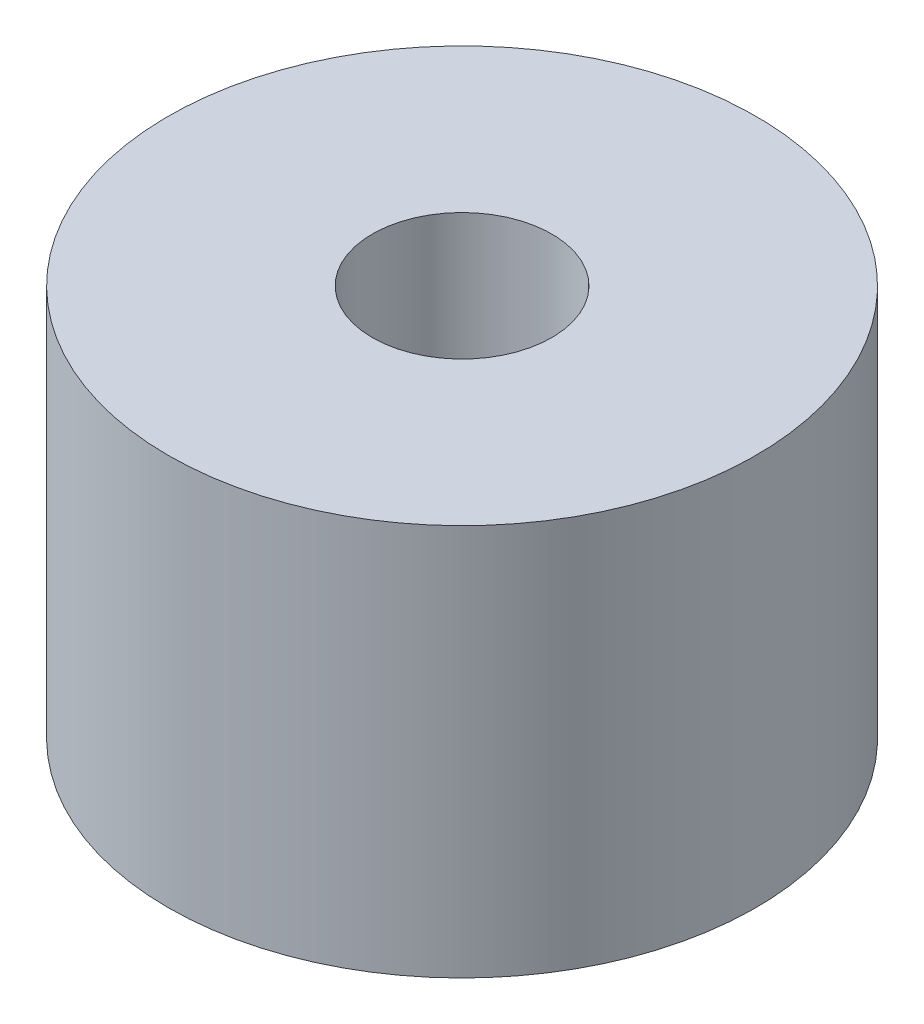
ISO-10303-21;
HEADER;
FILE_DESCRIPTION(('STEP AP214'),'2;1');
FILE_NAME('part.step','',(''),(''),'','','');
FILE_SCHEMA(('AUTOMOTIVE_DESIGN { 1 0 10303 214 1 1 1 1 }'));
ENDSEC;
DATA;
#1=APPLICATION_CONTEXT('core data for automotive mechanical design processes');
#2=APPLICATION_PROTOCOL_DEFINITION('international standard','automotive_design',2000,#1);
#3=PRODUCT_CONTEXT('',#1,'mechanical');
#4=PRODUCT('Part','Part','',(#3));
#5=PRODUCT_RELATED_PRODUCT_CATEGORY('part','',(#4));
#6=PRODUCT_DEFINITION_FORMATION('','',#4);
#7=PRODUCT_DEFINITION_CONTEXT('part definition',#1,'design');
#8=PRODUCT_DEFINITION('design','',#6,#7);
#9=PRODUCT_DEFINITION_SHAPE('','',#8);
#10=(LENGTH_UNIT() NAMED_UNIT(*) SI_UNIT(.MILLI.,.METRE.));
#11=(NAMED_UNIT(*) PLANE_ANGLE_UNIT() SI_UNIT($,.RADIAN.));
#12=(NAMED_UNIT(*) SI_UNIT($,.STERADIAN.) SOLID_ANGLE_UNIT());
#13=UNCERTAINTY_MEASURE_WITH_UNIT(LENGTH_MEASURE(1.E-05),#10,'distance_accuracy_value','');
#14=(GEOMETRIC_REPRESENTATION_CONTEXT(3) GLOBAL_UNCERTAINTY_ASSIGNED_CONTEXT((#13)) GLOBAL_UNIT_ASSIGNED_CONTEXT((#10,
#11,#12)) REPRESENTATION_CONTEXT('',''));
#15=CARTESIAN_POINT('',(0.,0.,0.));
#16=DIRECTION('',(0.,0.,1.));
#17=DIRECTION('',(1.,0.,0.));
#18=AXIS2_PLACEMENT_3D('',#15,#16,#17);
#19=CARTESIAN_POINT('',(0.,24.,0.));
#20=DIRECTION('',(0.,1.,0.));
#21=DIRECTION('',(0.,0.,1.));
#22=AXIS2_PLACEMENT_3D('',#19,#20,#21);
#23=PLANE('',#22);
#24=CARTESIAN_POINT('',(0.,24.,0.));
#25=DIRECTION('',(0.,1.,0.));
#26=DIRECTION('',(0.,0.,1.));
#27=AXIS2_PLACEMENT_3D('',#24,#25,#26);
#28=CIRCLE('',#27,18.);
#29=CARTESIAN_POINT('',(0.,24.,18.));
#30=VERTEX_POINT('',#29);
#31=EDGE_CURVE('E10',#30,#30,#28,.T.);
#32=ORIENTED_EDGE('',*,*,#31,.T.);
#33=EDGE_LOOP('',(#32));
#34=FACE_BOUND('',#33,.T.);
#35=CARTESIAN_POINT('',(0.,24.,0.));
#36=DIRECTION('',(0.,1.,0.));
#37=DIRECTION('',(0.,0.,1.));
#38=AXIS2_PLACEMENT_3D('',#35,#36,#37);
#39=CIRCLE('',#38,5.5);
#40=CARTESIAN_POINT('',(0.,24.,5.5));
#41=VERTEX_POINT('',#40);
#42=EDGE_CURVE('E41',#41,#41,#39,.T.);
#43=ORIENTED_EDGE('',*,*,#42,.F.);
#44=EDGE_LOOP('',(#43));
#45=FACE_BOUND('',#44,.T.);
#46=ADVANCED_FACE('F30',(#34,#45),#23,.T.);
#47=CARTESIAN_POINT('',(0.,0.,0.));
#48=DIRECTION('',(0.,1.,0.));
#49=DIRECTION('',(0.,0.,1.));
#50=AXIS2_PLACEMENT_3D('',#47,#48,#49);
#51=PLANE('',#50);
#52=CARTESIAN_POINT('',(0.,0.,0.));
#53=DIRECTION('',(0.,1.,0.));
#54=DIRECTION('',(0.,0.,1.));
#55=AXIS2_PLACEMENT_3D('',#52,#53,#54);
#56=CIRCLE('',#55,18.);
#57=CARTESIAN_POINT('',(0.,0.,18.));
#58=VERTEX_POINT('',#57);
#59=EDGE_CURVE('E34',#58,#58,#56,.T.);
#60=ORIENTED_EDGE('',*,*,#59,.F.);
#61=EDGE_LOOP('',(#60));
#62=FACE_BOUND('',#61,.T.);
#63=CARTESIAN_POINT('',(0.,0.,0.));
#64=DIRECTION('',(0.,1.,0.));
#65=DIRECTION('',(0.,0.,1.));
#66=AXIS2_PLACEMENT_3D('',#63,#64,#65);
#67=CIRCLE('',#66,5.5);
#68=CARTESIAN_POINT('',(0.,0.,5.5));
#69=VERTEX_POINT('',#68);
#70=EDGE_CURVE('E43',#69,#69,#67,.T.);
#71=ORIENTED_EDGE('',*,*,#70,.T.);
#72=EDGE_LOOP('',(#71));
#73=FACE_BOUND('',#72,.T.);
#74=ADVANCED_FACE('F53',(#62,#73),#51,.F.);
#75=CARTESIAN_POINT('',(0.,24.,0.));
#76=DIRECTION('',(0.,-1.,0.));
#77=DIRECTION('',(0.,0.,-1.));
#78=AXIS2_PLACEMENT_3D('',#75,#76,#77);
#79=CYLINDRICAL_SURFACE('',#78,18.);
#80=ORIENTED_EDGE('',*,*,#31,.F.);
#81=EDGE_LOOP('',(#80));
#82=FACE_BOUND('',#81,.T.);
#83=ORIENTED_EDGE('',*,*,#59,.T.);
#84=EDGE_LOOP('',(#83));
#85=FACE_BOUND('',#84,.T.);
#86=ADVANCED_FACE('F32',(#82,#85),#79,.T.);
#87=CARTESIAN_POINT('',(0.,24.,0.));
#88=DIRECTION('',(0.,-1.,0.));
#89=DIRECTION('',(0.,0.,-1.));
#90=AXIS2_PLACEMENT_3D('',#87,#88,#89);
#91=CYLINDRICAL_SURFACE('',#90,5.5);
#92=ORIENTED_EDGE('',*,*,#42,.T.);
#93=EDGE_LOOP('',(#92));
#94=FACE_BOUND('',#93,.T.);
#95=ORIENTED_EDGE('',*,*,#70,.F.);
#96=EDGE_LOOP('',(#95));
#97=FACE_BOUND('',#96,.T.);
#98=ADVANCED_FACE('F49',(#94,#97),#91,.F.);
#99=CLOSED_SHELL('',(#46,#74,#86,#98));
#100=MANIFOLD_SOLID_BREP('B2',#99);
#101=ADVANCED_BREP_SHAPE_REPRESENTATION('',(#18,#100),#14);
#102=SHAPE_DEFINITION_REPRESENTATION(#9,#101);
ENDSEC;
END-ISO-10303-21;
